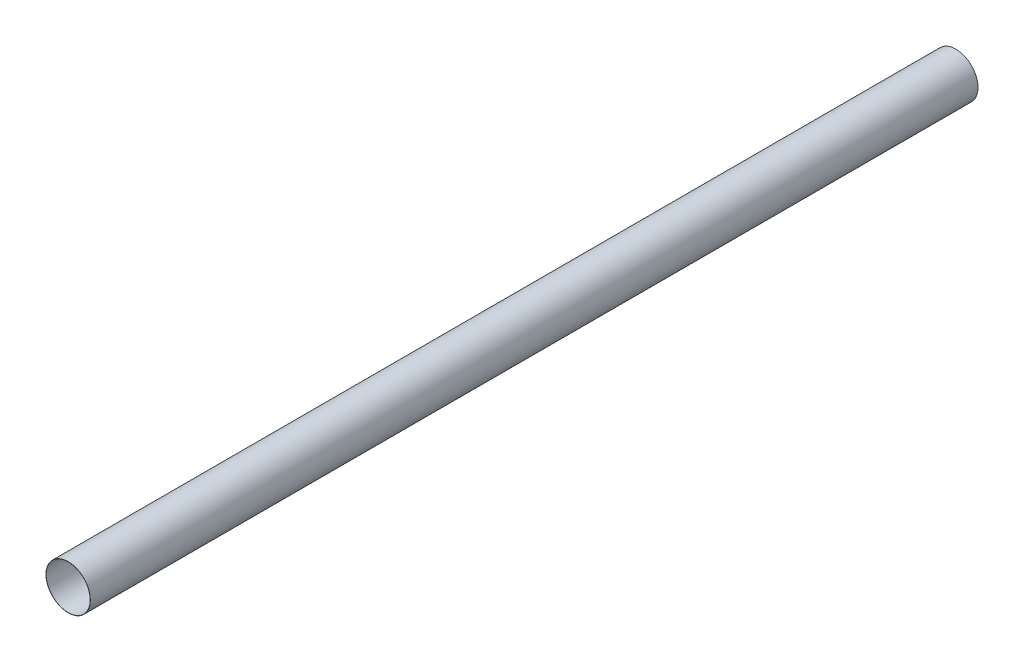
ISO-10303-21;
HEADER;
FILE_DESCRIPTION(('STEP AP214'),'2;1');
FILE_NAME('part.step','',(''),(''),'','','');
FILE_SCHEMA(('AUTOMOTIVE_DESIGN { 1 0 10303 214 1 1 1 1 }'));
ENDSEC;
DATA;
#1=APPLICATION_CONTEXT('core data for automotive mechanical design processes');
#2=APPLICATION_PROTOCOL_DEFINITION('international standard','automotive_design',2000,#1);
#3=PRODUCT_CONTEXT('',#1,'mechanical');
#4=PRODUCT('Part','Part','',(#3));
#5=PRODUCT_RELATED_PRODUCT_CATEGORY('part','',(#4));
#6=PRODUCT_DEFINITION_FORMATION('','',#4);
#7=PRODUCT_DEFINITION_CONTEXT('part definition',#1,'design');
#8=PRODUCT_DEFINITION('design','',#6,#7);
#9=PRODUCT_DEFINITION_SHAPE('','',#8);
#10=(LENGTH_UNIT() NAMED_UNIT(*) SI_UNIT(.MILLI.,.METRE.));
#11=(NAMED_UNIT(*) PLANE_ANGLE_UNIT() SI_UNIT($,.RADIAN.));
#12=(NAMED_UNIT(*) SI_UNIT($,.STERADIAN.) SOLID_ANGLE_UNIT());
#13=UNCERTAINTY_MEASURE_WITH_UNIT(LENGTH_MEASURE(1.E-05),#10,'distance_accuracy_value','');
#14=(GEOMETRIC_REPRESENTATION_CONTEXT(3) GLOBAL_UNCERTAINTY_ASSIGNED_CONTEXT((#13)) GLOBAL_UNIT_ASSIGNED_CONTEXT((#10,
#11,#12)) REPRESENTATION_CONTEXT('',''));
#15=CARTESIAN_POINT('',(0.,0.,0.));
#16=DIRECTION('',(0.,0.,1.));
#17=DIRECTION('',(1.,0.,0.));
#18=AXIS2_PLACEMENT_3D('',#15,#16,#17);
#19=CARTESIAN_POINT('',(0.,0.,10000.));
#20=DIRECTION('',(0.,0.,1.));
#21=DIRECTION('',(1.,0.,0.));
#22=AXIS2_PLACEMENT_3D('',#19,#20,#21);
#23=PLANE('',#22);
#24=CARTESIAN_POINT('',(0.,0.,10000.));
#25=DIRECTION('',(0.,0.,1.));
#26=DIRECTION('',(1.,0.,0.));
#27=AXIS2_PLACEMENT_3D('',#24,#25,#26);
#28=CIRCLE('',#27,250.);
#29=CARTESIAN_POINT('',(250.,0.,10000.));
#30=VERTEX_POINT('',#29);
#31=EDGE_CURVE('E10',#30,#30,#28,.T.);
#32=ORIENTED_EDGE('',*,*,#31,.T.);
#33=EDGE_LOOP('',(#32));
#34=FACE_BOUND('',#33,.T.);
#35=CARTESIAN_POINT('',(0.,0.,10000.));
#36=DIRECTION('',(0.,0.,1.));
#37=DIRECTION('',(1.,0.,0.));
#38=AXIS2_PLACEMENT_3D('',#35,#36,#37);
#39=CIRCLE('',#38,248.);
#40=CARTESIAN_POINT('',(248.,0.,10000.));
#41=VERTEX_POINT('',#40);
#42=EDGE_CURVE('E51',#41,#41,#39,.T.);
#43=ORIENTED_EDGE('',*,*,#42,.F.);
#44=EDGE_LOOP('',(#43));
#45=FACE_BOUND('',#44,.T.);
#46=ADVANCED_FACE('F40',(#34,#45),#23,.T.);
#47=CARTESIAN_POINT('',(0.,0.,0.));
#48=DIRECTION('',(0.,0.,1.));
#49=DIRECTION('',(1.,0.,0.));
#50=AXIS2_PLACEMENT_3D('',#47,#48,#49);
#51=PLANE('',#50);
#52=CARTESIAN_POINT('',(0.,0.,0.));
#53=DIRECTION('',(0.,0.,1.));
#54=DIRECTION('',(1.,0.,0.));
#55=AXIS2_PLACEMENT_3D('',#52,#53,#54);
#56=CIRCLE('',#55,250.);
#57=CARTESIAN_POINT('',(250.,0.,0.));
#58=VERTEX_POINT('',#57);
#59=EDGE_CURVE('E44',#58,#58,#56,.T.);
#60=ORIENTED_EDGE('',*,*,#59,.F.);
#61=EDGE_LOOP('',(#60));
#62=FACE_BOUND('',#61,.T.);
#63=CARTESIAN_POINT('',(0.,0.,0.));
#64=DIRECTION('',(0.,0.,1.));
#65=DIRECTION('',(1.,0.,0.));
#66=AXIS2_PLACEMENT_3D('',#63,#64,#65);
#67=CIRCLE('',#66,248.);
#68=CARTESIAN_POINT('',(248.,0.,0.));
#69=VERTEX_POINT('',#68);
#70=EDGE_CURVE('E53',#69,#69,#67,.T.);
#71=ORIENTED_EDGE('',*,*,#70,.T.);
#72=EDGE_LOOP('',(#71));
#73=FACE_BOUND('',#72,.T.);
#74=ADVANCED_FACE('F63',(#62,#73),#51,.F.);
#75=CARTESIAN_POINT('',(0.,0.,10000.));
#76=DIRECTION('',(0.,0.,-1.));
#77=DIRECTION('',(-1.,0.,0.));
#78=AXIS2_PLACEMENT_3D('',#75,#76,#77);
#79=CYLINDRICAL_SURFACE('',#78,250.);
#80=ORIENTED_EDGE('',*,*,#31,.F.);
#81=EDGE_LOOP('',(#80));
#82=FACE_BOUND('',#81,.T.);
#83=ORIENTED_EDGE('',*,*,#59,.T.);
#84=EDGE_LOOP('',(#83));
#85=FACE_BOUND('',#84,.T.);
#86=ADVANCED_FACE('F42',(#82,#85),#79,.T.);
#87=CARTESIAN_POINT('',(0.,0.,10000.));
#88=DIRECTION('',(0.,0.,-1.));
#89=DIRECTION('',(-1.,0.,0.));
#90=AXIS2_PLACEMENT_3D('',#87,#88,#89);
#91=CYLINDRICAL_SURFACE('',#90,248.);
#92=ORIENTED_EDGE('',*,*,#42,.T.);
#93=EDGE_LOOP('',(#92));
#94=FACE_BOUND('',#93,.T.);
#95=ORIENTED_EDGE('',*,*,#70,.F.);
#96=EDGE_LOOP('',(#95));
#97=FACE_BOUND('',#96,.T.);
#98=ADVANCED_FACE('F59',(#94,#97),#91,.F.);
#99=CLOSED_SHELL('',(#46,#74,#86,#98));
#100=MANIFOLD_SOLID_BREP('B2',#99);
#101=ADVANCED_BREP_SHAPE_REPRESENTATION('',(#18,#100),#14);
#102=SHAPE_DEFINITION_REPRESENTATION(#9,#101);
ENDSEC;
END-ISO-10303-21;
